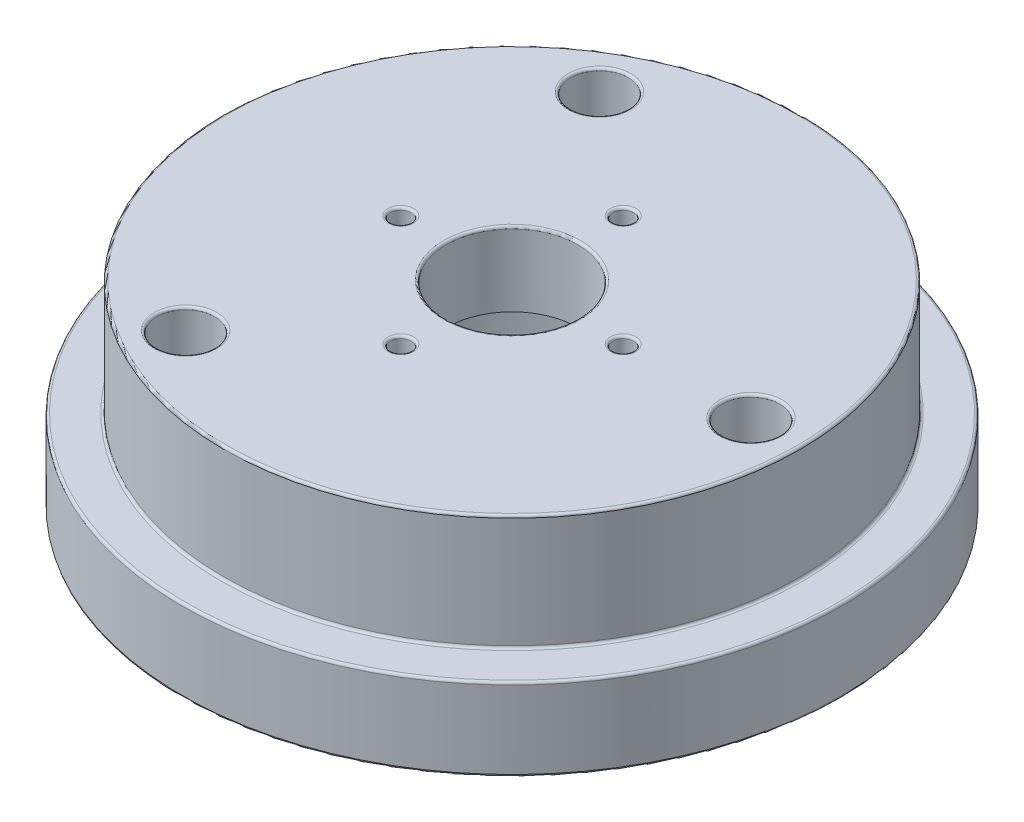
ISO-10303-21;
HEADER;
FILE_DESCRIPTION(('STEP AP214'),'2;1');
FILE_NAME('part.step','',(''),(''),'','','');
FILE_SCHEMA(('AUTOMOTIVE_DESIGN { 1 0 10303 214 1 1 1 1 }'));
ENDSEC;
DATA;
#1=APPLICATION_CONTEXT('core data for automotive mechanical design processes');
#2=APPLICATION_PROTOCOL_DEFINITION('international standard','automotive_design',2000,#1);
#3=PRODUCT_CONTEXT('',#1,'mechanical');
#4=PRODUCT('Part','Part','',(#3));
#5=PRODUCT_RELATED_PRODUCT_CATEGORY('part','',(#4));
#6=PRODUCT_DEFINITION_FORMATION('','',#4);
#7=PRODUCT_DEFINITION_CONTEXT('part definition',#1,'design');
#8=PRODUCT_DEFINITION('design','',#6,#7);
#9=PRODUCT_DEFINITION_SHAPE('','',#8);
#10=(LENGTH_UNIT() NAMED_UNIT(*) SI_UNIT(.MILLI.,.METRE.));
#11=(NAMED_UNIT(*) PLANE_ANGLE_UNIT() SI_UNIT($,.RADIAN.));
#12=(NAMED_UNIT(*) SI_UNIT($,.STERADIAN.) SOLID_ANGLE_UNIT());
#13=UNCERTAINTY_MEASURE_WITH_UNIT(LENGTH_MEASURE(1.E-05),#10,'distance_accuracy_value','');
#14=(GEOMETRIC_REPRESENTATION_CONTEXT(3) GLOBAL_UNCERTAINTY_ASSIGNED_CONTEXT((#13)) GLOBAL_UNIT_ASSIGNED_CONTEXT((#10,
#11,#12)) REPRESENTATION_CONTEXT('',''));
#15=CARTESIAN_POINT('',(0.,0.,0.));
#16=DIRECTION('',(0.,0.,1.));
#17=DIRECTION('',(1.,0.,0.));
#18=AXIS2_PLACEMENT_3D('',#15,#16,#17);
#19=CARTESIAN_POINT('',(0.,12.,-6.75));
#20=DIRECTION('',(0.,-1.,0.));
#21=DIRECTION('',(1.,0.,0.));
#22=AXIS2_PLACEMENT_3D('',#19,#20,#21);
#23=CYLINDRICAL_SURFACE('',#22,0.625);
#24=CARTESIAN_POINT('',(0.,11.85,-6.75));
#25=DIRECTION('',(0.,1.,0.));
#26=DIRECTION('',(-1.,0.,0.));
#27=AXIS2_PLACEMENT_3D('',#24,#25,#26);
#28=CIRCLE('',#27,0.625);
#29=CARTESIAN_POINT('',(-0.625,11.85,-6.75));
#30=VERTEX_POINT('',#29);
#31=EDGE_CURVE('E50',#30,#30,#28,.T.);
#32=ORIENTED_EDGE('',*,*,#31,.T.);
#33=EDGE_LOOP('',(#32));
#34=FACE_BOUND('',#33,.T.);
#35=CARTESIAN_POINT('',(0.,7.5,-6.75));
#36=DIRECTION('',(0.,-1.,0.));
#37=DIRECTION('',(1.,0.,0.));
#38=AXIS2_PLACEMENT_3D('',#35,#36,#37);
#39=CIRCLE('',#38,0.625);
#40=CARTESIAN_POINT('',(0.625,7.5,-6.75));
#41=VERTEX_POINT('',#40);
#42=EDGE_CURVE('E143',#41,#41,#39,.T.);
#43=ORIENTED_EDGE('',*,*,#42,.T.);
#44=EDGE_LOOP('',(#43));
#45=FACE_BOUND('',#44,.T.);
#46=ADVANCED_FACE('F30',(#34,#45),#23,.F.);
#47=CARTESIAN_POINT('',(6.75,12.,0.));
#48=DIRECTION('',(0.,-1.,0.));
#49=DIRECTION('',(1.,0.,0.));
#50=AXIS2_PLACEMENT_3D('',#47,#48,#49);
#51=CYLINDRICAL_SURFACE('',#50,0.625);
#52=CARTESIAN_POINT('',(6.75,11.85,0.));
#53=DIRECTION('',(0.,1.,0.));
#54=DIRECTION('',(-1.,0.,0.));
#55=AXIS2_PLACEMENT_3D('',#52,#53,#54);
#56=CIRCLE('',#55,0.625);
#57=CARTESIAN_POINT('',(6.125,11.85,0.));
#58=VERTEX_POINT('',#57);
#59=EDGE_CURVE('E45',#58,#58,#56,.T.);
#60=ORIENTED_EDGE('',*,*,#59,.T.);
#61=EDGE_LOOP('',(#60));
#62=FACE_BOUND('',#61,.T.);
#63=CARTESIAN_POINT('',(6.75,7.5,0.));
#64=DIRECTION('',(0.,-1.,0.));
#65=DIRECTION('',(1.,0.,0.));
#66=AXIS2_PLACEMENT_3D('',#63,#64,#65);
#67=CIRCLE('',#66,0.625);
#68=CARTESIAN_POINT('',(7.375,7.5,0.));
#69=VERTEX_POINT('',#68);
#70=EDGE_CURVE('E140',#69,#69,#67,.T.);
#71=ORIENTED_EDGE('',*,*,#70,.T.);
#72=EDGE_LOOP('',(#71));
#73=FACE_BOUND('',#72,.T.);
#74=ADVANCED_FACE('F182',(#62,#73),#51,.F.);
#75=CARTESIAN_POINT('',(0.,12.,6.75));
#76=DIRECTION('',(0.,-1.,0.));
#77=DIRECTION('',(1.,0.,0.));
#78=AXIS2_PLACEMENT_3D('',#75,#76,#77);
#79=CYLINDRICAL_SURFACE('',#78,0.625);
#80=CARTESIAN_POINT('',(0.,11.85,6.75));
#81=DIRECTION('',(0.,1.,0.));
#82=DIRECTION('',(-1.,0.,0.));
#83=AXIS2_PLACEMENT_3D('',#80,#81,#82);
#84=CIRCLE('',#83,0.625);
#85=CARTESIAN_POINT('',(-0.624999999999999,11.85,6.75));
#86=VERTEX_POINT('',#85);
#87=EDGE_CURVE('E41',#86,#86,#84,.T.);
#88=ORIENTED_EDGE('',*,*,#87,.T.);
#89=EDGE_LOOP('',(#88));
#90=FACE_BOUND('',#89,.T.);
#91=CARTESIAN_POINT('',(0.,7.5,6.75));
#92=DIRECTION('',(0.,-1.,0.));
#93=DIRECTION('',(1.,0.,0.));
#94=AXIS2_PLACEMENT_3D('',#91,#92,#93);
#95=CIRCLE('',#94,0.625);
#96=CARTESIAN_POINT('',(0.625,7.5,6.75));
#97=VERTEX_POINT('',#96);
#98=EDGE_CURVE('E149',#97,#97,#95,.T.);
#99=ORIENTED_EDGE('',*,*,#98,.T.);
#100=EDGE_LOOP('',(#99));
#101=FACE_BOUND('',#100,.T.);
#102=ADVANCED_FACE('F153',(#90,#101),#79,.F.);
#103=CARTESIAN_POINT('',(0.,12.,0.));
#104=DIRECTION('',(0.,-1.,0.));
#105=DIRECTION('',(1.,0.,0.));
#106=AXIS2_PLACEMENT_3D('',#103,#104,#105);
#107=CYLINDRICAL_SURFACE('',#106,4.);
#108=CARTESIAN_POINT('',(0.,11.85,0.));
#109=DIRECTION('',(0.,1.,0.));
#110=DIRECTION('',(-1.,0.,0.));
#111=AXIS2_PLACEMENT_3D('',#108,#109,#110);
#112=CIRCLE('',#111,4.);
#113=CARTESIAN_POINT('',(4.,11.85,0.));
#114=VERTEX_POINT('',#113);
#115=EDGE_CURVE('E37',#114,#114,#112,.T.);
#116=CARTESIAN_POINT('',(0.,7.5,0.));
#117=DIRECTION('',(0.,-1.,0.));
#118=DIRECTION('',(1.,0.,0.));
#119=AXIS2_PLACEMENT_3D('',#116,#117,#118);
#120=CIRCLE('',#119,4.);
#121=CARTESIAN_POINT('',(4.,7.5,0.));
#122=VERTEX_POINT('',#121);
#123=EDGE_CURVE('E137',#122,#122,#120,.T.);
#124=CARTESIAN_POINT('',(4.,11.85,0.));
#125=CARTESIAN_POINT('',(4.,11.8046875,0.));
#126=CARTESIAN_POINT('',(4.,11.759375,0.));
#127=CARTESIAN_POINT('',(4.,11.66875,0.));
#128=CARTESIAN_POINT('',(4.,11.6234375,0.));
#129=CARTESIAN_POINT('',(4.,11.5328125,0.));
#130=CARTESIAN_POINT('',(4.,11.4875,0.));
#131=CARTESIAN_POINT('',(4.,11.396875,0.));
#132=CARTESIAN_POINT('',(4.,11.3515625,0.));
#133=CARTESIAN_POINT('',(4.,11.2609375,0.));
#134=CARTESIAN_POINT('',(4.,11.215625,0.));
#135=CARTESIAN_POINT('',(4.,11.125,0.));
#136=CARTESIAN_POINT('',(4.,11.0796875,0.));
#137=CARTESIAN_POINT('',(4.,10.9890625,0.));
#138=CARTESIAN_POINT('',(4.,10.94375,0.));
#139=CARTESIAN_POINT('',(4.,10.853125,0.));
#140=CARTESIAN_POINT('',(4.,10.8078125,0.));
#141=CARTESIAN_POINT('',(4.,10.7171875,0.));
#142=CARTESIAN_POINT('',(4.,10.671875,0.));
#143=CARTESIAN_POINT('',(4.,10.58125,0.));
#144=CARTESIAN_POINT('',(4.,10.5359375,0.));
#145=CARTESIAN_POINT('',(4.,10.4453125,0.));
#146=CARTESIAN_POINT('',(4.,10.4,0.));
#147=CARTESIAN_POINT('',(4.,10.309375,0.));
#148=CARTESIAN_POINT('',(4.,10.2640625,0.));
#149=CARTESIAN_POINT('',(4.,10.1734375,0.));
#150=CARTESIAN_POINT('',(4.,10.128125,0.));
#151=CARTESIAN_POINT('',(4.,10.0375,0.));
#152=CARTESIAN_POINT('',(4.,9.9921875,0.));
#153=CARTESIAN_POINT('',(4.,9.9015625,0.));
#154=CARTESIAN_POINT('',(4.,9.85625,0.));
#155=CARTESIAN_POINT('',(4.,9.765625,0.));
#156=CARTESIAN_POINT('',(4.,9.7203125,0.));
#157=CARTESIAN_POINT('',(4.,9.6296875,0.));
#158=CARTESIAN_POINT('',(4.,9.584375,0.));
#159=CARTESIAN_POINT('',(4.,9.49375,0.));
#160=CARTESIAN_POINT('',(4.,9.4484375,0.));
#161=CARTESIAN_POINT('',(4.,9.3578125,0.));
#162=CARTESIAN_POINT('',(4.,9.3125,0.));
#163=CARTESIAN_POINT('',(4.,9.221875,0.));
#164=CARTESIAN_POINT('',(4.,9.1765625,0.));
#165=CARTESIAN_POINT('',(4.,9.0859375,0.));
#166=CARTESIAN_POINT('',(4.,9.040625,0.));
#167=CARTESIAN_POINT('',(4.,8.95,0.));
#168=CARTESIAN_POINT('',(4.,8.9046875,0.));
#169=CARTESIAN_POINT('',(4.,8.8140625,0.));
#170=CARTESIAN_POINT('',(4.,8.76875,0.));
#171=CARTESIAN_POINT('',(4.,8.678125,0.));
#172=CARTESIAN_POINT('',(4.,8.6328125,0.));
#173=CARTESIAN_POINT('',(4.,8.5421875,0.));
#174=CARTESIAN_POINT('',(4.,8.496875,0.));
#175=CARTESIAN_POINT('',(4.,8.40625,0.));
#176=CARTESIAN_POINT('',(4.,8.3609375,0.));
#177=CARTESIAN_POINT('',(4.,8.2703125,0.));
#178=CARTESIAN_POINT('',(4.,8.225,0.));
#179=CARTESIAN_POINT('',(4.,8.134375,0.));
#180=CARTESIAN_POINT('',(4.,8.0890625,0.));
#181=CARTESIAN_POINT('',(4.,7.9984375,0.));
#182=CARTESIAN_POINT('',(4.,7.953125,0.));
#183=CARTESIAN_POINT('',(4.,7.8625,0.));
#184=CARTESIAN_POINT('',(4.,7.8171875,0.));
#185=CARTESIAN_POINT('',(4.,7.7265625,0.));
#186=CARTESIAN_POINT('',(4.,7.68125,0.));
#187=CARTESIAN_POINT('',(4.,7.590625,0.));
#188=CARTESIAN_POINT('',(4.,7.5453125,0.));
#189=CARTESIAN_POINT('',(4.,7.5,0.));
#190=B_SPLINE_CURVE_WITH_KNOTS('',3,(#124,#125,#126,#127,#128,#129,#130,#131,#132,#133,#134,
#135,#136,#137,#138,#139,#140,#141,#142,#143,#144,#145,#146,#147,#148,#149,#150,#151,#152,#153,
#154,#155,#156,#157,#158,#159,#160,#161,#162,#163,#164,#165,#166,#167,#168,#169,#170,#171,#172,
#173,#174,#175,#176,#177,#178,#179,#180,#181,#182,#183,#184,#185,#186,#187,#188,#189),
.UNSPECIFIED.,.F.,.F.,(4,2,2,2,2,2,2,2,2,2,2,2,2,2,2,2,2,2,2,2,2,2,2,2,2,2,2,2,2,2,2,2,4),(0.,
0.135937499999999,0.271875,0.407812499999998,0.543749999999999,0.6796875,0.815624999999999,
0.951562499999999,1.0875,1.2234375,1.359375,1.4953125,1.63125,1.7671875,1.903125,2.0390625,
2.175,2.3109375,2.446875,2.5828125,2.71875,2.8546875,2.990625,3.1265625,3.2625,3.3984375,
3.534375,3.6703125,3.80625,3.9421875,4.078125,4.2140625,4.35),.UNSPECIFIED.);
#191=EDGE_CURVE('BSEAM193',#114,#122,#190,.T.);
#192=ORIENTED_EDGE('',*,*,#115,.T.);
#193=ORIENTED_EDGE('',*,*,#123,.T.);
#194=ORIENTED_EDGE('',*,*,#191,.T.);
#195=ORIENTED_EDGE('',*,*,#191,.F.);
#196=EDGE_LOOP('',(#192,#194,#193,#195));
#197=FACE_BOUND('',#196,.T.);
#198=ADVANCED_FACE('F193',(#197),#107,.F.);
#199=CARTESIAN_POINT('',(-6.75,12.,0.));
#200=DIRECTION('',(0.,-1.,0.));
#201=DIRECTION('',(1.,0.,0.));
#202=AXIS2_PLACEMENT_3D('',#199,#200,#201);
#203=CYLINDRICAL_SURFACE('',#202,0.625);
#204=CARTESIAN_POINT('',(-6.75,11.85,0.));
#205=DIRECTION('',(0.,1.,0.));
#206=DIRECTION('',(-1.,0.,0.));
#207=AXIS2_PLACEMENT_3D('',#204,#205,#206);
#208=CIRCLE('',#207,0.625);
#209=CARTESIAN_POINT('',(-7.375,11.85,0.));
#210=VERTEX_POINT('',#209);
#211=EDGE_CURVE('E10',#210,#210,#208,.T.);
#212=ORIENTED_EDGE('',*,*,#211,.T.);
#213=EDGE_LOOP('',(#212));
#214=FACE_BOUND('',#213,.T.);
#215=CARTESIAN_POINT('',(-6.75,7.5,0.));
#216=DIRECTION('',(0.,-1.,0.));
#217=DIRECTION('',(1.,0.,0.));
#218=AXIS2_PLACEMENT_3D('',#215,#216,#217);
#219=CIRCLE('',#218,0.625);
#220=CARTESIAN_POINT('',(-6.125,7.5,0.));
#221=VERTEX_POINT('',#220);
#222=EDGE_CURVE('E146',#221,#221,#219,.T.);
#223=ORIENTED_EDGE('',*,*,#222,.T.);
#224=EDGE_LOOP('',(#223));
#225=FACE_BOUND('',#224,.T.);
#226=ADVANCED_FACE('F196',(#214,#225),#203,.F.);
#227=CARTESIAN_POINT('',(0.,0.,0.));
#228=DIRECTION('',(0.,-1.,0.));
#229=DIRECTION('',(1.,0.,0.));
#230=AXIS2_PLACEMENT_3D('',#227,#228,#229);
#231=PLANE('',#230);
#232=CARTESIAN_POINT('',(0.,0.,0.));
#233=DIRECTION('',(0.,-1.,0.));
#234=DIRECTION('',(1.,0.,0.));
#235=AXIS2_PLACEMENT_3D('',#232,#233,#234);
#236=CIRCLE('',#235,19.85);
#237=CARTESIAN_POINT('',(19.85,0.,0.));
#238=VERTEX_POINT('',#237);
#239=EDGE_CURVE('E113',#238,#238,#236,.T.);
#240=ORIENTED_EDGE('',*,*,#239,.T.);
#241=EDGE_LOOP('',(#240));
#242=FACE_BOUND('',#241,.T.);
#243=CARTESIAN_POINT('',(-7.25000000000006,0.,-12.5573683548743));
#244=DIRECTION('',(0.,-1.,0.));
#245=DIRECTION('',(1.,0.,0.));
#246=AXIS2_PLACEMENT_3D('',#243,#244,#245);
#247=CIRCLE('',#246,1.9);
#248=CARTESIAN_POINT('',(-5.35000000000006,0.,-12.5573683548743));
#249=VERTEX_POINT('',#248);
#250=EDGE_CURVE('E116',#249,#249,#247,.F.);
#251=ORIENTED_EDGE('',*,*,#250,.T.);
#252=EDGE_LOOP('',(#251));
#253=FACE_BOUND('',#252,.T.);
#254=CARTESIAN_POINT('',(14.5,0.,0.));
#255=DIRECTION('',(0.,-1.,0.));
#256=DIRECTION('',(1.,0.,0.));
#257=AXIS2_PLACEMENT_3D('',#254,#255,#256);
#258=CIRCLE('',#257,1.9);
#259=CARTESIAN_POINT('',(16.4,0.,0.));
#260=VERTEX_POINT('',#259);
#261=EDGE_CURVE('E119',#260,#260,#258,.F.);
#262=ORIENTED_EDGE('',*,*,#261,.T.);
#263=EDGE_LOOP('',(#262));
#264=FACE_BOUND('',#263,.T.);
#265=CARTESIAN_POINT('',(-7.24999999999988,0.,12.5573683548744));
#266=DIRECTION('',(0.,-1.,0.));
#267=DIRECTION('',(1.,0.,0.));
#268=AXIS2_PLACEMENT_3D('',#265,#266,#267);
#269=CIRCLE('',#268,1.9);
#270=CARTESIAN_POINT('',(-5.34999999999988,0.,12.5573683548744));
#271=VERTEX_POINT('',#270);
#272=EDGE_CURVE('E122',#271,#271,#269,.F.);
#273=ORIENTED_EDGE('',*,*,#272,.T.);
#274=EDGE_LOOP('',(#273));
#275=FACE_BOUND('',#274,.T.);
#276=CARTESIAN_POINT('',(0.,0.,0.));
#277=DIRECTION('',(0.,-1.,0.));
#278=DIRECTION('',(1.,0.,0.));
#279=AXIS2_PLACEMENT_3D('',#276,#277,#278);
#280=CIRCLE('',#279,10.15);
#281=CARTESIAN_POINT('',(10.15,0.,0.));
#282=VERTEX_POINT('',#281);
#283=EDGE_CURVE('E125',#282,#282,#280,.F.);
#284=ORIENTED_EDGE('',*,*,#283,.T.);
#285=EDGE_LOOP('',(#284));
#286=FACE_BOUND('',#285,.T.);
#287=ADVANCED_FACE('F216',(#242,#253,#264,#275,#286),#231,.T.);
#288=CARTESIAN_POINT('',(0.,12.,0.));
#289=DIRECTION('',(0.,1.,0.));
#290=DIRECTION('',(-1.,0.,0.));
#291=AXIS2_PLACEMENT_3D('',#288,#289,#290);
#292=CYLINDRICAL_SURFACE('',#291,20.);
#293=CARTESIAN_POINT('',(0.,0.149999999999999,0.));
#294=DIRECTION('',(0.,-1.,0.));
#295=DIRECTION('',(1.,0.,0.));
#296=AXIS2_PLACEMENT_3D('',#293,#294,#295);
#297=CIRCLE('',#296,20.);
#298=CARTESIAN_POINT('',(20.,0.149999999999999,0.));
#299=VERTEX_POINT('',#298);
#300=EDGE_CURVE('E128',#299,#299,#297,.F.);
#301=ORIENTED_EDGE('',*,*,#300,.T.);
#302=EDGE_LOOP('',(#301));
#303=FACE_BOUND('',#302,.T.);
#304=CARTESIAN_POINT('',(0.,4.85,0.));
#305=DIRECTION('',(0.,1.,0.));
#306=DIRECTION('',(-1.,0.,0.));
#307=AXIS2_PLACEMENT_3D('',#304,#305,#306);
#308=CIRCLE('',#307,20.);
#309=CARTESIAN_POINT('',(-20.,4.85,0.));
#310=VERTEX_POINT('',#309);
#311=EDGE_CURVE('E131',#310,#310,#308,.F.);
#312=ORIENTED_EDGE('',*,*,#311,.T.);
#313=EDGE_LOOP('',(#312));
#314=FACE_BOUND('',#313,.T.);
#315=ADVANCED_FACE('F212',(#303,#314),#292,.T.);
#316=CARTESIAN_POINT('',(-20.,5.,0.));
#317=DIRECTION('',(0.,1.,0.));
#318=DIRECTION('',(-1.,0.,0.));
#319=AXIS2_PLACEMENT_3D('',#316,#317,#318);
#320=PLANE('',#319);
#321=CARTESIAN_POINT('',(0.,5.,0.));
#322=DIRECTION('',(0.,1.,0.));
#323=DIRECTION('',(-1.,0.,0.));
#324=AXIS2_PLACEMENT_3D('',#321,#322,#323);
#325=CIRCLE('',#324,17.65);
#326=CARTESIAN_POINT('',(-17.65,5.,0.));
#327=VERTEX_POINT('',#326);
#328=EDGE_CURVE('E80',#327,#327,#325,.F.);
#329=ORIENTED_EDGE('',*,*,#328,.T.);
#330=EDGE_LOOP('',(#329));
#331=FACE_BOUND('',#330,.T.);
#332=CARTESIAN_POINT('',(0.,5.,0.));
#333=DIRECTION('',(0.,1.,0.));
#334=DIRECTION('',(-1.,0.,0.));
#335=AXIS2_PLACEMENT_3D('',#332,#333,#334);
#336=CIRCLE('',#335,19.85);
#337=CARTESIAN_POINT('',(-19.85,5.,0.));
#338=VERTEX_POINT('',#337);
#339=EDGE_CURVE('E83',#338,#338,#336,.T.);
#340=ORIENTED_EDGE('',*,*,#339,.T.);
#341=EDGE_LOOP('',(#340));
#342=FACE_BOUND('',#341,.T.);
#343=ADVANCED_FACE('F208',(#331,#342),#320,.T.);
#344=CARTESIAN_POINT('',(0.,12.,0.));
#345=DIRECTION('',(0.,1.,0.));
#346=DIRECTION('',(-1.,0.,0.));
#347=AXIS2_PLACEMENT_3D('',#344,#345,#346);
#348=CYLINDRICAL_SURFACE('',#347,17.5);
#349=CARTESIAN_POINT('',(0.,5.15,0.));
#350=DIRECTION('',(0.,1.,0.));
#351=DIRECTION('',(-1.,0.,0.));
#352=AXIS2_PLACEMENT_3D('',#349,#350,#351);
#353=CIRCLE('',#352,17.5);
#354=CARTESIAN_POINT('',(-17.5,5.15,0.));
#355=VERTEX_POINT('',#354);
#356=EDGE_CURVE('E86',#355,#355,#353,.T.);
#357=ORIENTED_EDGE('',*,*,#356,.T.);
#358=EDGE_LOOP('',(#357));
#359=FACE_BOUND('',#358,.T.);
#360=CARTESIAN_POINT('',(0.,11.85,0.));
#361=DIRECTION('',(0.,1.,0.));
#362=DIRECTION('',(-1.,0.,0.));
#363=AXIS2_PLACEMENT_3D('',#360,#361,#362);
#364=CIRCLE('',#363,17.5);
#365=CARTESIAN_POINT('',(-17.5,11.85,0.));
#366=VERTEX_POINT('',#365);
#367=EDGE_CURVE('E89',#366,#366,#364,.F.);
#368=ORIENTED_EDGE('',*,*,#367,.T.);
#369=EDGE_LOOP('',(#368));
#370=FACE_BOUND('',#369,.T.);
#371=ADVANCED_FACE('F204',(#359,#370),#348,.T.);
#372=CARTESIAN_POINT('',(-17.5,12.,0.));
#373=DIRECTION('',(0.,1.,0.));
#374=DIRECTION('',(-1.,0.,0.));
#375=AXIS2_PLACEMENT_3D('',#372,#373,#374);
#376=PLANE('',#375);
#377=CARTESIAN_POINT('',(0.,12.,0.));
#378=DIRECTION('',(0.,1.,0.));
#379=DIRECTION('',(-1.,0.,0.));
#380=AXIS2_PLACEMENT_3D('',#377,#378,#379);
#381=CIRCLE('',#380,17.35);
#382=CARTESIAN_POINT('',(-17.35,12.,0.));
#383=VERTEX_POINT('',#382);
#384=EDGE_CURVE('E53',#383,#383,#381,.T.);
#385=ORIENTED_EDGE('',*,*,#384,.T.);
#386=EDGE_LOOP('',(#385));
#387=FACE_BOUND('',#386,.T.);
#388=CARTESIAN_POINT('',(0.,12.,-6.75));
#389=DIRECTION('',(0.,1.,0.));
#390=DIRECTION('',(-1.,0.,0.));
#391=AXIS2_PLACEMENT_3D('',#388,#389,#390);
#392=CIRCLE('',#391,0.775);
#393=CARTESIAN_POINT('',(-0.775,12.,-6.75));
#394=VERTEX_POINT('',#393);
#395=EDGE_CURVE('E56',#394,#394,#392,.F.);
#396=ORIENTED_EDGE('',*,*,#395,.T.);
#397=EDGE_LOOP('',(#396));
#398=FACE_BOUND('',#397,.T.);
#399=CARTESIAN_POINT('',(6.75,12.,0.));
#400=DIRECTION('',(0.,1.,0.));
#401=DIRECTION('',(-1.,0.,0.));
#402=AXIS2_PLACEMENT_3D('',#399,#400,#401);
#403=CIRCLE('',#402,0.775);
#404=CARTESIAN_POINT('',(5.975,12.,0.));
#405=VERTEX_POINT('',#404);
#406=EDGE_CURVE('E59',#405,#405,#403,.F.);
#407=ORIENTED_EDGE('',*,*,#406,.T.);
#408=EDGE_LOOP('',(#407));
#409=FACE_BOUND('',#408,.T.);
#410=CARTESIAN_POINT('',(0.,12.,6.75));
#411=DIRECTION('',(0.,1.,0.));
#412=DIRECTION('',(-1.,0.,0.));
#413=AXIS2_PLACEMENT_3D('',#410,#411,#412);
#414=CIRCLE('',#413,0.775);
#415=CARTESIAN_POINT('',(-0.774999999999999,12.,6.75));
#416=VERTEX_POINT('',#415);
#417=EDGE_CURVE('E62',#416,#416,#414,.F.);
#418=ORIENTED_EDGE('',*,*,#417,.T.);
#419=EDGE_LOOP('',(#418));
#420=FACE_BOUND('',#419,.T.);
#421=CARTESIAN_POINT('',(0.,12.,0.));
#422=DIRECTION('',(0.,1.,0.));
#423=DIRECTION('',(-1.,0.,0.));
#424=AXIS2_PLACEMENT_3D('',#421,#422,#423);
#425=CIRCLE('',#424,4.15);
#426=CARTESIAN_POINT('',(-4.15,12.,0.));
#427=VERTEX_POINT('',#426);
#428=EDGE_CURVE('E65',#427,#427,#425,.F.);
#429=ORIENTED_EDGE('',*,*,#428,.T.);
#430=EDGE_LOOP('',(#429));
#431=FACE_BOUND('',#430,.T.);
#432=CARTESIAN_POINT('',(-6.75,12.,0.));
#433=DIRECTION('',(0.,1.,0.));
#434=DIRECTION('',(-1.,0.,0.));
#435=AXIS2_PLACEMENT_3D('',#432,#433,#434);
#436=CIRCLE('',#435,0.775);
#437=CARTESIAN_POINT('',(-7.525,12.,0.));
#438=VERTEX_POINT('',#437);
#439=EDGE_CURVE('E68',#438,#438,#436,.F.);
#440=ORIENTED_EDGE('',*,*,#439,.T.);
#441=EDGE_LOOP('',(#440));
#442=FACE_BOUND('',#441,.T.);
#443=CARTESIAN_POINT('',(-7.25000000000006,12.,-12.5573683548743));
#444=DIRECTION('',(0.,1.,0.));
#445=DIRECTION('',(-1.,0.,0.));
#446=AXIS2_PLACEMENT_3D('',#443,#444,#445);
#447=CIRCLE('',#446,1.9);
#448=CARTESIAN_POINT('',(-9.15000000000006,12.,-12.5573683548743));
#449=VERTEX_POINT('',#448);
#450=EDGE_CURVE('E71',#449,#449,#447,.F.);
#451=ORIENTED_EDGE('',*,*,#450,.T.);
#452=EDGE_LOOP('',(#451));
#453=FACE_BOUND('',#452,.T.);
#454=CARTESIAN_POINT('',(14.5,12.,0.));
#455=DIRECTION('',(0.,1.,0.));
#456=DIRECTION('',(-1.,0.,0.));
#457=AXIS2_PLACEMENT_3D('',#454,#455,#456);
#458=CIRCLE('',#457,1.9);
#459=CARTESIAN_POINT('',(12.6,12.,0.));
#460=VERTEX_POINT('',#459);
#461=EDGE_CURVE('E74',#460,#460,#458,.F.);
#462=ORIENTED_EDGE('',*,*,#461,.T.);
#463=EDGE_LOOP('',(#462));
#464=FACE_BOUND('',#463,.T.);
#465=CARTESIAN_POINT('',(-7.24999999999988,12.,12.5573683548744));
#466=DIRECTION('',(0.,1.,0.));
#467=DIRECTION('',(-1.,0.,0.));
#468=AXIS2_PLACEMENT_3D('',#465,#466,#467);
#469=CIRCLE('',#468,1.9);
#470=CARTESIAN_POINT('',(-9.14999999999988,12.,12.5573683548744));
#471=VERTEX_POINT('',#470);
#472=EDGE_CURVE('E77',#471,#471,#469,.F.);
#473=ORIENTED_EDGE('',*,*,#472,.T.);
#474=EDGE_LOOP('',(#473));
#475=FACE_BOUND('',#474,.T.);
#476=ADVANCED_FACE('F200',(#387,#398,#409,#420,#431,#442,#453,#464,#475),#376,.T.);
#477=CARTESIAN_POINT('',(-7.25000000000006,12.,-12.5573683548743));
#478=DIRECTION('',(0.,-1.,0.));
#479=DIRECTION('',(1.,0.,0.));
#480=AXIS2_PLACEMENT_3D('',#477,#478,#479);
#481=CYLINDRICAL_SURFACE('',#480,1.75);
#482=CARTESIAN_POINT('',(-7.25000000000006,0.149999999999999,-12.5573683548743));
#483=DIRECTION('',(0.,-1.,0.));
#484=DIRECTION('',(1.,0.,0.));
#485=AXIS2_PLACEMENT_3D('',#482,#483,#484);
#486=CIRCLE('',#485,1.75);
#487=CARTESIAN_POINT('',(-5.50000000000006,0.149999999999997,-12.5573683548743));
#488=VERTEX_POINT('',#487);
#489=EDGE_CURVE('E107',#488,#488,#486,.T.);
#490=CARTESIAN_POINT('',(-7.25000000000006,11.85,-12.5573683548743));
#491=DIRECTION('',(0.,1.,0.));
#492=DIRECTION('',(-1.,0.,0.));
#493=AXIS2_PLACEMENT_3D('',#490,#491,#492);
#494=CIRCLE('',#493,1.75);
#495=CARTESIAN_POINT('',(-5.50000000000006,11.85,-12.5573683548743));
#496=VERTEX_POINT('',#495);
#497=EDGE_CURVE('E110',#496,#496,#494,.T.);
#498=CARTESIAN_POINT('',(-5.50000000000006,0.149999999999997,-12.5573683548743));
#499=CARTESIAN_POINT('',(-5.50000000000006,0.271874999999997,-12.5573683548743));
#500=CARTESIAN_POINT('',(-5.50000000000006,0.393749999999997,-12.5573683548743));
#501=CARTESIAN_POINT('',(-5.50000000000006,0.637499999999997,-12.5573683548743));
#502=CARTESIAN_POINT('',(-5.50000000000006,0.759374999999997,-12.5573683548743));
#503=CARTESIAN_POINT('',(-5.50000000000006,1.003125,-12.5573683548743));
#504=CARTESIAN_POINT('',(-5.50000000000006,1.125,-12.5573683548743));
#505=CARTESIAN_POINT('',(-5.50000000000006,1.36875,-12.5573683548743));
#506=CARTESIAN_POINT('',(-5.50000000000006,1.490625,-12.5573683548743));
#507=CARTESIAN_POINT('',(-5.50000000000006,1.734375,-12.5573683548743));
#508=CARTESIAN_POINT('',(-5.50000000000006,1.85625,-12.5573683548743));
#509=CARTESIAN_POINT('',(-5.50000000000006,2.1,-12.5573683548743));
#510=CARTESIAN_POINT('',(-5.50000000000006,2.221875,-12.5573683548743));
#511=CARTESIAN_POINT('',(-5.50000000000006,2.465625,-12.5573683548743));
#512=CARTESIAN_POINT('',(-5.50000000000006,2.5875,-12.5573683548743));
#513=CARTESIAN_POINT('',(-5.50000000000006,2.83125,-12.5573683548743));
#514=CARTESIAN_POINT('',(-5.50000000000006,2.953125,-12.5573683548743));
#515=CARTESIAN_POINT('',(-5.50000000000006,3.196875,-12.5573683548743));
#516=CARTESIAN_POINT('',(-5.50000000000006,3.31875,-12.5573683548743));
#517=CARTESIAN_POINT('',(-5.50000000000006,3.5625,-12.5573683548743));
#518=CARTESIAN_POINT('',(-5.50000000000006,3.684375,-12.5573683548743));
#519=CARTESIAN_POINT('',(-5.50000000000006,3.928125,-12.5573683548743));
#520=CARTESIAN_POINT('',(-5.50000000000006,4.05,-12.5573683548743));
#521=CARTESIAN_POINT('',(-5.50000000000006,4.29375,-12.5573683548743));
#522=CARTESIAN_POINT('',(-5.50000000000006,4.415625,-12.5573683548743));
#523=CARTESIAN_POINT('',(-5.50000000000006,4.659375,-12.5573683548743));
#524=CARTESIAN_POINT('',(-5.50000000000006,4.78125,-12.5573683548743));
#525=CARTESIAN_POINT('',(-5.50000000000006,5.025,-12.5573683548743));
#526=CARTESIAN_POINT('',(-5.50000000000006,5.146875,-12.5573683548743));
#527=CARTESIAN_POINT('',(-5.50000000000006,5.390625,-12.5573683548743));
#528=CARTESIAN_POINT('',(-5.50000000000006,5.5125,-12.5573683548743));
#529=CARTESIAN_POINT('',(-5.50000000000006,5.75625,-12.5573683548743));
#530=CARTESIAN_POINT('',(-5.50000000000006,5.878125,-12.5573683548743));
#531=CARTESIAN_POINT('',(-5.50000000000006,6.121875,-12.5573683548743));
#532=CARTESIAN_POINT('',(-5.50000000000006,6.24375,-12.5573683548743));
#533=CARTESIAN_POINT('',(-5.50000000000006,6.4875,-12.5573683548743));
#534=CARTESIAN_POINT('',(-5.50000000000006,6.609375,-12.5573683548743));
#535=CARTESIAN_POINT('',(-5.50000000000006,6.853125,-12.5573683548743));
#536=CARTESIAN_POINT('',(-5.50000000000006,6.975,-12.5573683548743));
#537=CARTESIAN_POINT('',(-5.50000000000006,7.21875,-12.5573683548743));
#538=CARTESIAN_POINT('',(-5.50000000000006,7.340625,-12.5573683548743));
#539=CARTESIAN_POINT('',(-5.50000000000006,7.584375,-12.5573683548743));
#540=CARTESIAN_POINT('',(-5.50000000000006,7.70625,-12.5573683548743));
#541=CARTESIAN_POINT('',(-5.50000000000006,7.95,-12.5573683548743));
#542=CARTESIAN_POINT('',(-5.50000000000006,8.071875,-12.5573683548743));
#543=CARTESIAN_POINT('',(-5.50000000000006,8.315625,-12.5573683548743));
#544=CARTESIAN_POINT('',(-5.50000000000006,8.4375,-12.5573683548743));
#545=CARTESIAN_POINT('',(-5.50000000000006,8.68125,-12.5573683548743));
#546=CARTESIAN_POINT('',(-5.50000000000006,8.803125,-12.5573683548743));
#547=CARTESIAN_POINT('',(-5.50000000000006,9.046875,-12.5573683548743));
#548=CARTESIAN_POINT('',(-5.50000000000006,9.16875,-12.5573683548743));
#549=CARTESIAN_POINT('',(-5.50000000000006,9.4125,-12.5573683548743));
#550=CARTESIAN_POINT('',(-5.50000000000006,9.534375,-12.5573683548743));
#551=CARTESIAN_POINT('',(-5.50000000000006,9.778125,-12.5573683548743));
#552=CARTESIAN_POINT('',(-5.50000000000006,9.9,-12.5573683548743));
#553=CARTESIAN_POINT('',(-5.50000000000006,10.14375,-12.5573683548743));
#554=CARTESIAN_POINT('',(-5.50000000000006,10.265625,-12.5573683548743));
#555=CARTESIAN_POINT('',(-5.50000000000006,10.509375,-12.5573683548743));
#556=CARTESIAN_POINT('',(-5.50000000000006,10.63125,-12.5573683548743));
#557=CARTESIAN_POINT('',(-5.50000000000006,10.875,-12.5573683548743));
#558=CARTESIAN_POINT('',(-5.50000000000006,10.996875,-12.5573683548743));
#559=CARTESIAN_POINT('',(-5.50000000000006,11.240625,-12.5573683548743));
#560=CARTESIAN_POINT('',(-5.50000000000006,11.3625,-12.5573683548743));
#561=CARTESIAN_POINT('',(-5.50000000000006,11.60625,-12.5573683548743));
#562=CARTESIAN_POINT('',(-5.50000000000006,11.728125,-12.5573683548743));
#563=CARTESIAN_POINT('',(-5.50000000000006,11.85,-12.5573683548743));
#564=B_SPLINE_CURVE_WITH_KNOTS('',3,(#498,#499,#500,#501,#502,#503,#504,#505,#506,#507,#508,
#509,#510,#511,#512,#513,#514,#515,#516,#517,#518,#519,#520,#521,#522,#523,#524,#525,#526,#527,
#528,#529,#530,#531,#532,#533,#534,#535,#536,#537,#538,#539,#540,#541,#542,#543,#544,#545,#546,
#547,#548,#549,#550,#551,#552,#553,#554,#555,#556,#557,#558,#559,#560,#561,#562,#563),
.UNSPECIFIED.,.F.,.F.,(4,2,2,2,2,2,2,2,2,2,2,2,2,2,2,2,2,2,2,2,2,2,2,2,2,2,2,2,2,2,2,2,4),(0.,
0.365625,0.731249999999999,1.096875,1.4625,1.828125,2.19375,2.559375,2.925,3.290625,3.65625,
4.021875,4.3875,4.753125,5.11875,5.484375,5.85,6.215625,6.58125,6.946875,7.3125,7.678125,
8.04375,8.409375,8.775,9.140625,9.50625,9.871875,10.2375,10.603125,10.96875,11.334375,11.7),.UNSPECIFIED.);
#565=EDGE_CURVE('BSEAM203',#488,#496,#564,.T.);
#566=ORIENTED_EDGE('',*,*,#489,.T.);
#567=ORIENTED_EDGE('',*,*,#497,.T.);
#568=ORIENTED_EDGE('',*,*,#565,.T.);
#569=ORIENTED_EDGE('',*,*,#565,.F.);
#570=EDGE_LOOP('',(#566,#568,#567,#569));
#571=FACE_BOUND('',#570,.T.);
#572=ADVANCED_FACE('F203',(#571),#481,.F.);
#573=CARTESIAN_POINT('',(14.5,12.,0.));
#574=DIRECTION('',(0.,-1.,0.));
#575=DIRECTION('',(1.,0.,0.));
#576=AXIS2_PLACEMENT_3D('',#573,#574,#575);
#577=CYLINDRICAL_SURFACE('',#576,1.75);
#578=CARTESIAN_POINT('',(14.5,0.149999999999999,0.));
#579=DIRECTION('',(0.,-1.,0.));
#580=DIRECTION('',(1.,0.,0.));
#581=AXIS2_PLACEMENT_3D('',#578,#579,#580);
#582=CIRCLE('',#581,1.75);
#583=CARTESIAN_POINT('',(16.25,0.149999999999999,0.));
#584=VERTEX_POINT('',#583);
#585=EDGE_CURVE('E101',#584,#584,#582,.T.);
#586=CARTESIAN_POINT('',(14.5,11.85,0.));
#587=DIRECTION('',(0.,1.,0.));
#588=DIRECTION('',(-1.,0.,0.));
#589=AXIS2_PLACEMENT_3D('',#586,#587,#588);
#590=CIRCLE('',#589,1.75);
#591=CARTESIAN_POINT('',(16.25,11.85,0.));
#592=VERTEX_POINT('',#591);
#593=EDGE_CURVE('E104',#592,#592,#590,.T.);
#594=CARTESIAN_POINT('',(16.25,0.149999999999999,0.));
#595=CARTESIAN_POINT('',(16.25,0.271874999999999,0.));
#596=CARTESIAN_POINT('',(16.25,0.393749999999999,0.));
#597=CARTESIAN_POINT('',(16.25,0.637499999999999,0.));
#598=CARTESIAN_POINT('',(16.25,0.759374999999998,0.));
#599=CARTESIAN_POINT('',(16.25,1.003125,0.));
#600=CARTESIAN_POINT('',(16.25,1.125,0.));
#601=CARTESIAN_POINT('',(16.25,1.36875,0.));
#602=CARTESIAN_POINT('',(16.25,1.490625,0.));
#603=CARTESIAN_POINT('',(16.25,1.734375,0.));
#604=CARTESIAN_POINT('',(16.25,1.85625,0.));
#605=CARTESIAN_POINT('',(16.25,2.1,0.));
#606=CARTESIAN_POINT('',(16.25,2.221875,0.));
#607=CARTESIAN_POINT('',(16.25,2.465625,0.));
#608=CARTESIAN_POINT('',(16.25,2.5875,0.));
#609=CARTESIAN_POINT('',(16.25,2.83125,0.));
#610=CARTESIAN_POINT('',(16.25,2.953125,0.));
#611=CARTESIAN_POINT('',(16.25,3.196875,0.));
#612=CARTESIAN_POINT('',(16.25,3.31875,0.));
#613=CARTESIAN_POINT('',(16.25,3.5625,0.));
#614=CARTESIAN_POINT('',(16.25,3.684375,0.));
#615=CARTESIAN_POINT('',(16.25,3.928125,0.));
#616=CARTESIAN_POINT('',(16.25,4.05,0.));
#617=CARTESIAN_POINT('',(16.25,4.29375,0.));
#618=CARTESIAN_POINT('',(16.25,4.415625,0.));
#619=CARTESIAN_POINT('',(16.25,4.659375,0.));
#620=CARTESIAN_POINT('',(16.25,4.78125,0.));
#621=CARTESIAN_POINT('',(16.25,5.025,0.));
#622=CARTESIAN_POINT('',(16.25,5.146875,0.));
#623=CARTESIAN_POINT('',(16.25,5.390625,0.));
#624=CARTESIAN_POINT('',(16.25,5.5125,0.));
#625=CARTESIAN_POINT('',(16.25,5.75625,0.));
#626=CARTESIAN_POINT('',(16.25,5.878125,0.));
#627=CARTESIAN_POINT('',(16.25,6.121875,0.));
#628=CARTESIAN_POINT('',(16.25,6.24375,0.));
#629=CARTESIAN_POINT('',(16.25,6.4875,0.));
#630=CARTESIAN_POINT('',(16.25,6.609375,0.));
#631=CARTESIAN_POINT('',(16.25,6.853125,0.));
#632=CARTESIAN_POINT('',(16.25,6.975,0.));
#633=CARTESIAN_POINT('',(16.25,7.21875,0.));
#634=CARTESIAN_POINT('',(16.25,7.340625,0.));
#635=CARTESIAN_POINT('',(16.25,7.584375,0.));
#636=CARTESIAN_POINT('',(16.25,7.70625,0.));
#637=CARTESIAN_POINT('',(16.25,7.95,0.));
#638=CARTESIAN_POINT('',(16.25,8.071875,0.));
#639=CARTESIAN_POINT('',(16.25,8.315625,0.));
#640=CARTESIAN_POINT('',(16.25,8.4375,0.));
#641=CARTESIAN_POINT('',(16.25,8.68125,0.));
#642=CARTESIAN_POINT('',(16.25,8.803125,0.));
#643=CARTESIAN_POINT('',(16.25,9.046875,0.));
#644=CARTESIAN_POINT('',(16.25,9.16875,0.));
#645=CARTESIAN_POINT('',(16.25,9.4125,0.));
#646=CARTESIAN_POINT('',(16.25,9.534375,0.));
#647=CARTESIAN_POINT('',(16.25,9.778125,0.));
#648=CARTESIAN_POINT('',(16.25,9.9,0.));
#649=CARTESIAN_POINT('',(16.25,10.14375,0.));
#650=CARTESIAN_POINT('',(16.25,10.265625,0.));
#651=CARTESIAN_POINT('',(16.25,10.509375,0.));
#652=CARTESIAN_POINT('',(16.25,10.63125,0.));
#653=CARTESIAN_POINT('',(16.25,10.875,0.));
#654=CARTESIAN_POINT('',(16.25,10.996875,0.));
#655=CARTESIAN_POINT('',(16.25,11.240625,0.));
#656=CARTESIAN_POINT('',(16.25,11.3625,0.));
#657=CARTESIAN_POINT('',(16.25,11.60625,0.));
#658=CARTESIAN_POINT('',(16.25,11.728125,0.));
#659=CARTESIAN_POINT('',(16.25,11.85,0.));
#660=B_SPLINE_CURVE_WITH_KNOTS('',3,(#594,#595,#596,#597,#598,#599,#600,#601,#602,#603,#604,
#605,#606,#607,#608,#609,#610,#611,#612,#613,#614,#615,#616,#617,#618,#619,#620,#621,#622,#623,
#624,#625,#626,#627,#628,#629,#630,#631,#632,#633,#634,#635,#636,#637,#638,#639,#640,#641,#642,
#643,#644,#645,#646,#647,#648,#649,#650,#651,#652,#653,#654,#655,#656,#657,#658,#659),
.UNSPECIFIED.,.F.,.F.,(4,2,2,2,2,2,2,2,2,2,2,2,2,2,2,2,2,2,2,2,2,2,2,2,2,2,2,2,2,2,2,2,4),(0.,
0.365625,0.731249999999999,1.096875,1.4625,1.828125,2.19375,2.559375,2.925,3.290625,3.65625,
4.021875,4.3875,4.753125,5.11875,5.484375,5.85,6.215625,6.58125,6.946875,7.3125,7.678125,
8.04375,8.409375,8.775,9.140625,9.50625,9.871875,10.2375,10.603125,10.96875,11.334375,11.7),.UNSPECIFIED.);
#661=EDGE_CURVE('BSEAM178',#584,#592,#660,.T.);
#662=ORIENTED_EDGE('',*,*,#585,.T.);
#663=ORIENTED_EDGE('',*,*,#593,.T.);
#664=ORIENTED_EDGE('',*,*,#661,.T.);
#665=ORIENTED_EDGE('',*,*,#661,.F.);
#666=EDGE_LOOP('',(#662,#664,#663,#665));
#667=FACE_BOUND('',#666,.T.);
#668=ADVANCED_FACE('F178',(#667),#577,.F.);
#669=CARTESIAN_POINT('',(-7.24999999999988,12.,12.5573683548744));
#670=DIRECTION('',(0.,-1.,0.));
#671=DIRECTION('',(1.,0.,0.));
#672=AXIS2_PLACEMENT_3D('',#669,#670,#671);
#673=CYLINDRICAL_SURFACE('',#672,1.75);
#674=CARTESIAN_POINT('',(-7.24999999999988,0.149999999999999,12.5573683548744));
#675=DIRECTION('',(0.,-1.,0.));
#676=DIRECTION('',(1.,0.,0.));
#677=AXIS2_PLACEMENT_3D('',#674,#675,#676);
#678=CIRCLE('',#677,1.75);
#679=CARTESIAN_POINT('',(-5.49999999999988,0.149999999999997,12.5573683548744));
#680=VERTEX_POINT('',#679);
#681=EDGE_CURVE('E95',#680,#680,#678,.T.);
#682=CARTESIAN_POINT('',(-7.24999999999988,11.85,12.5573683548744));
#683=DIRECTION('',(0.,1.,0.));
#684=DIRECTION('',(-1.,0.,0.));
#685=AXIS2_PLACEMENT_3D('',#682,#683,#684);
#686=CIRCLE('',#685,1.75);
#687=CARTESIAN_POINT('',(-5.49999999999988,11.85,12.5573683548744));
#688=VERTEX_POINT('',#687);
#689=EDGE_CURVE('E98',#688,#688,#686,.T.);
#690=CARTESIAN_POINT('',(-5.49999999999988,0.149999999999997,12.5573683548744));
#691=CARTESIAN_POINT('',(-5.49999999999988,0.271874999999997,12.5573683548744));
#692=CARTESIAN_POINT('',(-5.49999999999988,0.393749999999997,12.5573683548744));
#693=CARTESIAN_POINT('',(-5.49999999999988,0.637499999999997,12.5573683548744));
#694=CARTESIAN_POINT('',(-5.49999999999988,0.759374999999997,12.5573683548744));
#695=CARTESIAN_POINT('',(-5.49999999999988,1.003125,12.5573683548744));
#696=CARTESIAN_POINT('',(-5.49999999999988,1.125,12.5573683548744));
#697=CARTESIAN_POINT('',(-5.49999999999988,1.36875,12.5573683548744));
#698=CARTESIAN_POINT('',(-5.49999999999988,1.490625,12.5573683548744));
#699=CARTESIAN_POINT('',(-5.49999999999988,1.734375,12.5573683548744));
#700=CARTESIAN_POINT('',(-5.49999999999988,1.85625,12.5573683548744));
#701=CARTESIAN_POINT('',(-5.49999999999988,2.1,12.5573683548744));
#702=CARTESIAN_POINT('',(-5.49999999999988,2.221875,12.5573683548744));
#703=CARTESIAN_POINT('',(-5.49999999999988,2.465625,12.5573683548744));
#704=CARTESIAN_POINT('',(-5.49999999999988,2.5875,12.5573683548744));
#705=CARTESIAN_POINT('',(-5.49999999999988,2.83125,12.5573683548744));
#706=CARTESIAN_POINT('',(-5.49999999999988,2.953125,12.5573683548744));
#707=CARTESIAN_POINT('',(-5.49999999999988,3.196875,12.5573683548744));
#708=CARTESIAN_POINT('',(-5.49999999999988,3.31875,12.5573683548744));
#709=CARTESIAN_POINT('',(-5.49999999999988,3.5625,12.5573683548744));
#710=CARTESIAN_POINT('',(-5.49999999999988,3.684375,12.5573683548744));
#711=CARTESIAN_POINT('',(-5.49999999999988,3.928125,12.5573683548744));
#712=CARTESIAN_POINT('',(-5.49999999999988,4.05,12.5573683548744));
#713=CARTESIAN_POINT('',(-5.49999999999988,4.29375,12.5573683548744));
#714=CARTESIAN_POINT('',(-5.49999999999988,4.415625,12.5573683548744));
#715=CARTESIAN_POINT('',(-5.49999999999988,4.659375,12.5573683548744));
#716=CARTESIAN_POINT('',(-5.49999999999988,4.78125,12.5573683548744));
#717=CARTESIAN_POINT('',(-5.49999999999988,5.025,12.5573683548744));
#718=CARTESIAN_POINT('',(-5.49999999999988,5.146875,12.5573683548744));
#719=CARTESIAN_POINT('',(-5.49999999999988,5.390625,12.5573683548744));
#720=CARTESIAN_POINT('',(-5.49999999999988,5.5125,12.5573683548744));
#721=CARTESIAN_POINT('',(-5.49999999999988,5.75625,12.5573683548744));
#722=CARTESIAN_POINT('',(-5.49999999999988,5.878125,12.5573683548744));
#723=CARTESIAN_POINT('',(-5.49999999999988,6.121875,12.5573683548744));
#724=CARTESIAN_POINT('',(-5.49999999999988,6.24375,12.5573683548744));
#725=CARTESIAN_POINT('',(-5.49999999999988,6.4875,12.5573683548744));
#726=CARTESIAN_POINT('',(-5.49999999999988,6.609375,12.5573683548744));
#727=CARTESIAN_POINT('',(-5.49999999999988,6.853125,12.5573683548744));
#728=CARTESIAN_POINT('',(-5.49999999999988,6.975,12.5573683548744));
#729=CARTESIAN_POINT('',(-5.49999999999988,7.21875,12.5573683548744));
#730=CARTESIAN_POINT('',(-5.49999999999988,7.340625,12.5573683548744));
#731=CARTESIAN_POINT('',(-5.49999999999988,7.584375,12.5573683548744));
#732=CARTESIAN_POINT('',(-5.49999999999988,7.70625,12.5573683548744));
#733=CARTESIAN_POINT('',(-5.49999999999988,7.95,12.5573683548744));
#734=CARTESIAN_POINT('',(-5.49999999999988,8.071875,12.5573683548744));
#735=CARTESIAN_POINT('',(-5.49999999999988,8.315625,12.5573683548744));
#736=CARTESIAN_POINT('',(-5.49999999999988,8.4375,12.5573683548744));
#737=CARTESIAN_POINT('',(-5.49999999999988,8.68125,12.5573683548744));
#738=CARTESIAN_POINT('',(-5.49999999999988,8.803125,12.5573683548744));
#739=CARTESIAN_POINT('',(-5.49999999999988,9.046875,12.5573683548744));
#740=CARTESIAN_POINT('',(-5.49999999999988,9.16875,12.5573683548744));
#741=CARTESIAN_POINT('',(-5.49999999999988,9.4125,12.5573683548744));
#742=CARTESIAN_POINT('',(-5.49999999999988,9.534375,12.5573683548744));
#743=CARTESIAN_POINT('',(-5.49999999999988,9.778125,12.5573683548744));
#744=CARTESIAN_POINT('',(-5.49999999999988,9.9,12.5573683548744));
#745=CARTESIAN_POINT('',(-5.49999999999988,10.14375,12.5573683548744));
#746=CARTESIAN_POINT('',(-5.49999999999988,10.265625,12.5573683548744));
#747=CARTESIAN_POINT('',(-5.49999999999988,10.509375,12.5573683548744));
#748=CARTESIAN_POINT('',(-5.49999999999988,10.63125,12.5573683548744));
#749=CARTESIAN_POINT('',(-5.49999999999988,10.875,12.5573683548744));
#750=CARTESIAN_POINT('',(-5.49999999999988,10.996875,12.5573683548744));
#751=CARTESIAN_POINT('',(-5.49999999999988,11.240625,12.5573683548744));
#752=CARTESIAN_POINT('',(-5.49999999999988,11.3625,12.5573683548744));
#753=CARTESIAN_POINT('',(-5.49999999999988,11.60625,12.5573683548744));
#754=CARTESIAN_POINT('',(-5.49999999999988,11.728125,12.5573683548744));
#755=CARTESIAN_POINT('',(-5.49999999999988,11.85,12.5573683548744));
#756=B_SPLINE_CURVE_WITH_KNOTS('',3,(#690,#691,#692,#693,#694,#695,#696,#697,#698,#699,#700,
#701,#702,#703,#704,#705,#706,#707,#708,#709,#710,#711,#712,#713,#714,#715,#716,#717,#718,#719,
#720,#721,#722,#723,#724,#725,#726,#727,#728,#729,#730,#731,#732,#733,#734,#735,#736,#737,#738,
#739,#740,#741,#742,#743,#744,#745,#746,#747,#748,#749,#750,#751,#752,#753,#754,#755),
.UNSPECIFIED.,.F.,.F.,(4,2,2,2,2,2,2,2,2,2,2,2,2,2,2,2,2,2,2,2,2,2,2,2,2,2,2,2,2,2,2,2,4),(0.,
0.365625,0.731249999999999,1.096875,1.4625,1.828125,2.19375,2.559375,2.925,3.290625,3.65625,
4.021875,4.3875,4.753125,5.11875,5.484375,5.85,6.215625,6.58125,6.946875,7.3125,7.678125,
8.04375,8.409375,8.775,9.140625,9.50625,9.871875,10.2375,10.603125,10.96875,11.334375,11.7),.UNSPECIFIED.);
#757=EDGE_CURVE('BSEAM172',#680,#688,#756,.T.);
#758=ORIENTED_EDGE('',*,*,#681,.T.);
#759=ORIENTED_EDGE('',*,*,#689,.T.);
#760=ORIENTED_EDGE('',*,*,#757,.T.);
#761=ORIENTED_EDGE('',*,*,#757,.F.);
#762=EDGE_LOOP('',(#758,#760,#759,#761));
#763=FACE_BOUND('',#762,.T.);
#764=ADVANCED_FACE('F172',(#763),#673,.F.);
#765=CARTESIAN_POINT('',(0.,7.5,0.));
#766=DIRECTION('',(0.,-1.,0.));
#767=DIRECTION('',(1.,0.,0.));
#768=AXIS2_PLACEMENT_3D('',#765,#766,#767);
#769=CYLINDRICAL_SURFACE('',#768,10.);
#770=CARTESIAN_POINT('',(0.,0.149999999999999,0.));
#771=DIRECTION('',(0.,-1.,0.));
#772=DIRECTION('',(1.,0.,0.));
#773=AXIS2_PLACEMENT_3D('',#770,#771,#772);
#774=CIRCLE('',#773,10.);
#775=CARTESIAN_POINT('',(10.,0.149999999999999,0.));
#776=VERTEX_POINT('',#775);
#777=EDGE_CURVE('E92',#776,#776,#774,.T.);
#778=ORIENTED_EDGE('',*,*,#777,.T.);
#779=EDGE_LOOP('',(#778));
#780=FACE_BOUND('',#779,.T.);
#781=CARTESIAN_POINT('',(0.,7.5,0.));
#782=DIRECTION('',(0.,-1.,0.));
#783=DIRECTION('',(1.,0.,0.));
#784=AXIS2_PLACEMENT_3D('',#781,#782,#783);
#785=CIRCLE('',#784,10.);
#786=CARTESIAN_POINT('',(10.,7.5,0.));
#787=VERTEX_POINT('',#786);
#788=EDGE_CURVE('E134',#787,#787,#785,.T.);
#789=ORIENTED_EDGE('',*,*,#788,.F.);
#790=EDGE_LOOP('',(#789));
#791=FACE_BOUND('',#790,.T.);
#792=ADVANCED_FACE('F159',(#780,#791),#769,.F.);
#793=CARTESIAN_POINT('',(0.,7.5,0.));
#794=DIRECTION('',(0.,-1.,0.));
#795=DIRECTION('',(1.,0.,0.));
#796=AXIS2_PLACEMENT_3D('',#793,#794,#795);
#797=PLANE('',#796);
#798=ORIENTED_EDGE('',*,*,#98,.F.);
#799=EDGE_LOOP('',(#798));
#800=FACE_BOUND('',#799,.T.);
#801=ORIENTED_EDGE('',*,*,#222,.F.);
#802=EDGE_LOOP('',(#801));
#803=FACE_BOUND('',#802,.T.);
#804=ORIENTED_EDGE('',*,*,#42,.F.);
#805=EDGE_LOOP('',(#804));
#806=FACE_BOUND('',#805,.T.);
#807=ORIENTED_EDGE('',*,*,#70,.F.);
#808=EDGE_LOOP('',(#807));
#809=FACE_BOUND('',#808,.T.);
#810=ORIENTED_EDGE('',*,*,#123,.F.);
#811=EDGE_LOOP('',(#810));
#812=FACE_BOUND('',#811,.T.);
#813=ORIENTED_EDGE('',*,*,#788,.T.);
#814=EDGE_LOOP('',(#813));
#815=FACE_BOUND('',#814,.T.);
#816=ADVANCED_FACE('F155',(#800,#803,#806,#809,#812,#815),#797,.T.);
#817=CARTESIAN_POINT('',(0.,0.149999999999999,0.));
#818=DIRECTION('',(0.,-1.,0.));
#819=DIRECTION('',(1.,0.,0.));
#820=AXIS2_PLACEMENT_3D('',#817,#818,#819);
#821=TOROIDAL_SURFACE('',#820,19.85,0.15);
#822=ORIENTED_EDGE('',*,*,#239,.F.);
#823=EDGE_LOOP('',(#822));
#824=FACE_BOUND('',#823,.T.);
#825=ORIENTED_EDGE('',*,*,#300,.F.);
#826=EDGE_LOOP('',(#825));
#827=FACE_BOUND('',#826,.T.);
#828=ADVANCED_FACE('F158',(#824,#827),#821,.T.);
#829=CARTESIAN_POINT('',(-7.25000000000006,0.149999999999999,-12.5573683548743));
#830=DIRECTION('',(0.,-1.,0.));
#831=DIRECTION('',(1.,0.,0.));
#832=AXIS2_PLACEMENT_3D('',#829,#830,#831);
#833=TOROIDAL_SURFACE('',#832,1.9,0.15);
#834=ORIENTED_EDGE('',*,*,#250,.F.);
#835=EDGE_LOOP('',(#834));
#836=FACE_BOUND('',#835,.T.);
#837=ORIENTED_EDGE('',*,*,#489,.F.);
#838=EDGE_LOOP('',(#837));
#839=FACE_BOUND('',#838,.T.);
#840=ADVANCED_FACE('F223',(#836,#839),#833,.T.);
#841=CARTESIAN_POINT('',(14.5,0.149999999999999,0.));
#842=DIRECTION('',(0.,-1.,0.));
#843=DIRECTION('',(1.,0.,0.));
#844=AXIS2_PLACEMENT_3D('',#841,#842,#843);
#845=TOROIDAL_SURFACE('',#844,1.9,0.15);
#846=ORIENTED_EDGE('',*,*,#261,.F.);
#847=EDGE_LOOP('',(#846));
#848=FACE_BOUND('',#847,.T.);
#849=ORIENTED_EDGE('',*,*,#585,.F.);
#850=EDGE_LOOP('',(#849));
#851=FACE_BOUND('',#850,.T.);
#852=ADVANCED_FACE('F227',(#848,#851),#845,.T.);
#853=CARTESIAN_POINT('',(-7.24999999999988,0.149999999999999,12.5573683548744));
#854=DIRECTION('',(0.,-1.,0.));
#855=DIRECTION('',(1.,0.,0.));
#856=AXIS2_PLACEMENT_3D('',#853,#854,#855);
#857=TOROIDAL_SURFACE('',#856,1.9,0.15);
#858=ORIENTED_EDGE('',*,*,#272,.F.);
#859=EDGE_LOOP('',(#858));
#860=FACE_BOUND('',#859,.T.);
#861=ORIENTED_EDGE('',*,*,#681,.F.);
#862=EDGE_LOOP('',(#861));
#863=FACE_BOUND('',#862,.T.);
#864=ADVANCED_FACE('F231',(#860,#863),#857,.T.);
#865=CARTESIAN_POINT('',(0.,0.149999999999999,0.));
#866=DIRECTION('',(0.,-1.,0.));
#867=DIRECTION('',(1.,0.,0.));
#868=AXIS2_PLACEMENT_3D('',#865,#866,#867);
#869=TOROIDAL_SURFACE('',#868,10.15,0.15);
#870=ORIENTED_EDGE('',*,*,#283,.F.);
#871=EDGE_LOOP('',(#870));
#872=FACE_BOUND('',#871,.T.);
#873=ORIENTED_EDGE('',*,*,#777,.F.);
#874=EDGE_LOOP('',(#873));
#875=FACE_BOUND('',#874,.T.);
#876=ADVANCED_FACE('F235',(#872,#875),#869,.T.);
#877=CARTESIAN_POINT('',(0.,5.15,0.));
#878=DIRECTION('',(0.,1.,0.));
#879=DIRECTION('',(-1.,0.,0.));
#880=AXIS2_PLACEMENT_3D('',#877,#878,#879);
#881=TOROIDAL_SURFACE('',#880,17.65,0.15);
#882=ORIENTED_EDGE('',*,*,#328,.F.);
#883=EDGE_LOOP('',(#882));
#884=FACE_BOUND('',#883,.T.);
#885=ORIENTED_EDGE('',*,*,#356,.F.);
#886=EDGE_LOOP('',(#885));
#887=FACE_BOUND('',#886,.T.);
#888=ADVANCED_FACE('F239',(#884,#887),#881,.F.);
#889=CARTESIAN_POINT('',(0.,4.85,0.));
#890=DIRECTION('',(0.,1.,0.));
#891=DIRECTION('',(-1.,0.,0.));
#892=AXIS2_PLACEMENT_3D('',#889,#890,#891);
#893=TOROIDAL_SURFACE('',#892,19.85,0.15);
#894=ORIENTED_EDGE('',*,*,#311,.F.);
#895=EDGE_LOOP('',(#894));
#896=FACE_BOUND('',#895,.T.);
#897=ORIENTED_EDGE('',*,*,#339,.F.);
#898=EDGE_LOOP('',(#897));
#899=FACE_BOUND('',#898,.T.);
#900=ADVANCED_FACE('F243',(#896,#899),#893,.T.);
#901=CARTESIAN_POINT('',(0.,11.85,0.));
#902=DIRECTION('',(0.,1.,0.));
#903=DIRECTION('',(-1.,0.,0.));
#904=AXIS2_PLACEMENT_3D('',#901,#902,#903);
#905=TOROIDAL_SURFACE('',#904,17.35,0.15);
#906=ORIENTED_EDGE('',*,*,#367,.F.);
#907=EDGE_LOOP('',(#906));
#908=FACE_BOUND('',#907,.T.);
#909=ORIENTED_EDGE('',*,*,#384,.F.);
#910=EDGE_LOOP('',(#909));
#911=FACE_BOUND('',#910,.T.);
#912=ADVANCED_FACE('F247',(#908,#911),#905,.T.);
#913=CARTESIAN_POINT('',(0.,11.85,-6.75));
#914=DIRECTION('',(0.,1.,0.));
#915=DIRECTION('',(-1.,0.,0.));
#916=AXIS2_PLACEMENT_3D('',#913,#914,#915);
#917=TOROIDAL_SURFACE('',#916,0.775,0.15);
#918=ORIENTED_EDGE('',*,*,#31,.F.);
#919=EDGE_LOOP('',(#918));
#920=FACE_BOUND('',#919,.T.);
#921=ORIENTED_EDGE('',*,*,#395,.F.);
#922=EDGE_LOOP('',(#921));
#923=FACE_BOUND('',#922,.T.);
#924=ADVANCED_FACE('F251',(#920,#923),#917,.T.);
#925=CARTESIAN_POINT('',(6.75,11.85,0.));
#926=DIRECTION('',(0.,1.,0.));
#927=DIRECTION('',(-1.,0.,0.));
#928=AXIS2_PLACEMENT_3D('',#925,#926,#927);
#929=TOROIDAL_SURFACE('',#928,0.775,0.15);
#930=ORIENTED_EDGE('',*,*,#59,.F.);
#931=EDGE_LOOP('',(#930));
#932=FACE_BOUND('',#931,.T.);
#933=ORIENTED_EDGE('',*,*,#406,.F.);
#934=EDGE_LOOP('',(#933));
#935=FACE_BOUND('',#934,.T.);
#936=ADVANCED_FACE('F255',(#932,#935),#929,.T.);
#937=CARTESIAN_POINT('',(0.,11.85,6.75));
#938=DIRECTION('',(0.,1.,0.));
#939=DIRECTION('',(-1.,0.,0.));
#940=AXIS2_PLACEMENT_3D('',#937,#938,#939);
#941=TOROIDAL_SURFACE('',#940,0.775,0.15);
#942=ORIENTED_EDGE('',*,*,#87,.F.);
#943=EDGE_LOOP('',(#942));
#944=FACE_BOUND('',#943,.T.);
#945=ORIENTED_EDGE('',*,*,#417,.F.);
#946=EDGE_LOOP('',(#945));
#947=FACE_BOUND('',#946,.T.);
#948=ADVANCED_FACE('F259',(#944,#947),#941,.T.);
#949=CARTESIAN_POINT('',(0.,11.85,0.));
#950=DIRECTION('',(0.,1.,0.));
#951=DIRECTION('',(-1.,0.,0.));
#952=AXIS2_PLACEMENT_3D('',#949,#950,#951);
#953=TOROIDAL_SURFACE('',#952,4.15,0.15);
#954=ORIENTED_EDGE('',*,*,#115,.F.);
#955=EDGE_LOOP('',(#954));
#956=FACE_BOUND('',#955,.T.);
#957=ORIENTED_EDGE('',*,*,#428,.F.);
#958=EDGE_LOOP('',(#957));
#959=FACE_BOUND('',#958,.T.);
#960=ADVANCED_FACE('F263',(#956,#959),#953,.T.);
#961=CARTESIAN_POINT('',(-6.75,11.85,0.));
#962=DIRECTION('',(0.,1.,0.));
#963=DIRECTION('',(-1.,0.,0.));
#964=AXIS2_PLACEMENT_3D('',#961,#962,#963);
#965=TOROIDAL_SURFACE('',#964,0.775,0.15);
#966=ORIENTED_EDGE('',*,*,#211,.F.);
#967=EDGE_LOOP('',(#966));
#968=FACE_BOUND('',#967,.T.);
#969=ORIENTED_EDGE('',*,*,#439,.F.);
#970=EDGE_LOOP('',(#969));
#971=FACE_BOUND('',#970,.T.);
#972=ADVANCED_FACE('F267',(#968,#971),#965,.T.);
#973=CARTESIAN_POINT('',(-7.25000000000006,11.85,-12.5573683548743));
#974=DIRECTION('',(0.,1.,0.));
#975=DIRECTION('',(-1.,0.,0.));
#976=AXIS2_PLACEMENT_3D('',#973,#974,#975);
#977=TOROIDAL_SURFACE('',#976,1.9,0.15);
#978=ORIENTED_EDGE('',*,*,#497,.F.);
#979=EDGE_LOOP('',(#978));
#980=FACE_BOUND('',#979,.T.);
#981=ORIENTED_EDGE('',*,*,#450,.F.);
#982=EDGE_LOOP('',(#981));
#983=FACE_BOUND('',#982,.T.);
#984=ADVANCED_FACE('F271',(#980,#983),#977,.T.);
#985=CARTESIAN_POINT('',(14.5,11.85,0.));
#986=DIRECTION('',(0.,1.,0.));
#987=DIRECTION('',(-1.,0.,0.));
#988=AXIS2_PLACEMENT_3D('',#985,#986,#987);
#989=TOROIDAL_SURFACE('',#988,1.9,0.15);
#990=ORIENTED_EDGE('',*,*,#593,.F.);
#991=EDGE_LOOP('',(#990));
#992=FACE_BOUND('',#991,.T.);
#993=ORIENTED_EDGE('',*,*,#461,.F.);
#994=EDGE_LOOP('',(#993));
#995=FACE_BOUND('',#994,.T.);
#996=ADVANCED_FACE('F274',(#992,#995),#989,.T.);
#997=CARTESIAN_POINT('',(-7.24999999999988,11.85,12.5573683548744));
#998=DIRECTION('',(0.,1.,0.));
#999=DIRECTION('',(-1.,0.,0.));
#1000=AXIS2_PLACEMENT_3D('',#997,#998,#999);
#1001=TOROIDAL_SURFACE('',#1000,1.9,0.15);
#1002=ORIENTED_EDGE('',*,*,#689,.F.);
#1003=EDGE_LOOP('',(#1002));
#1004=FACE_BOUND('',#1003,.T.);
#1005=ORIENTED_EDGE('',*,*,#472,.F.);
#1006=EDGE_LOOP('',(#1005));
#1007=FACE_BOUND('',#1006,.T.);
#1008=ADVANCED_FACE('F32',(#1004,#1007),#1001,.T.);
#1009=CLOSED_SHELL('',(#46,#74,#102,#198,#226,#287,#315,#343,#371,#476,#572,#668,#764,#792,#816,
#828,#840,#852,#864,#876,#888,#900,#912,#924,#936,#948,#960,#972,#984,#996,#1008));
#1010=MANIFOLD_SOLID_BREP('B2',#1009);
#1011=ADVANCED_BREP_SHAPE_REPRESENTATION('',(#18,#1010),#14);
#1012=SHAPE_DEFINITION_REPRESENTATION(#9,#1011);
ENDSEC;
END-ISO-10303-21;
